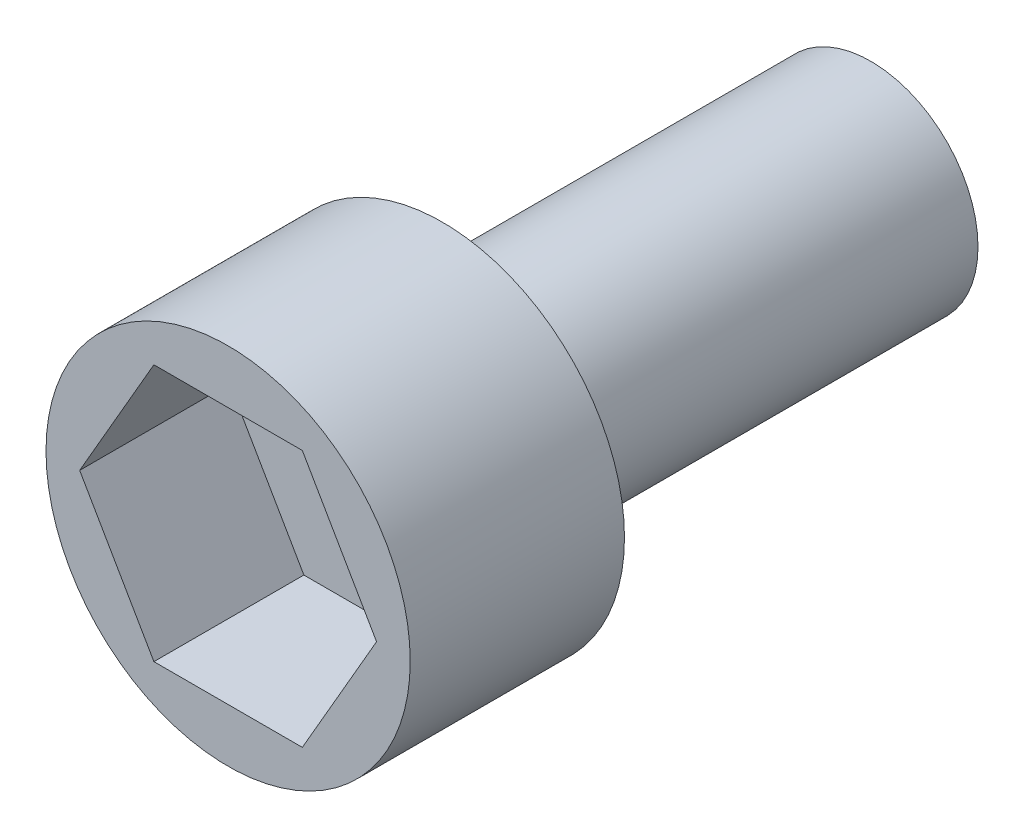
ISO-10303-21;
HEADER;
FILE_DESCRIPTION(('STEP AP214'),'2;1');
FILE_NAME('part.step','',(''),(''),'','','');
FILE_SCHEMA(('AUTOMOTIVE_DESIGN { 1 0 10303 214 1 1 1 1 }'));
ENDSEC;
DATA;
#1=APPLICATION_CONTEXT('core data for automotive mechanical design processes');
#2=APPLICATION_PROTOCOL_DEFINITION('international standard','automotive_design',2000,#1);
#3=PRODUCT_CONTEXT('',#1,'mechanical');
#4=PRODUCT('Part','Part','',(#3));
#5=PRODUCT_RELATED_PRODUCT_CATEGORY('part','',(#4));
#6=PRODUCT_DEFINITION_FORMATION('','',#4);
#7=PRODUCT_DEFINITION_CONTEXT('part definition',#1,'design');
#8=PRODUCT_DEFINITION('design','',#6,#7);
#9=PRODUCT_DEFINITION_SHAPE('','',#8);
#10=(LENGTH_UNIT() NAMED_UNIT(*) SI_UNIT(.MILLI.,.METRE.));
#11=(NAMED_UNIT(*) PLANE_ANGLE_UNIT() SI_UNIT($,.RADIAN.));
#12=(NAMED_UNIT(*) SI_UNIT($,.STERADIAN.) SOLID_ANGLE_UNIT());
#13=UNCERTAINTY_MEASURE_WITH_UNIT(LENGTH_MEASURE(1.E-05),#10,'distance_accuracy_value','');
#14=(GEOMETRIC_REPRESENTATION_CONTEXT(3) GLOBAL_UNCERTAINTY_ASSIGNED_CONTEXT((#13)) GLOBAL_UNIT_ASSIGNED_CONTEXT((#10,
#11,#12)) REPRESENTATION_CONTEXT('',''));
#15=CARTESIAN_POINT('',(0.,0.,0.));
#16=DIRECTION('',(0.,0.,1.));
#17=DIRECTION('',(1.,0.,0.));
#18=AXIS2_PLACEMENT_3D('',#15,#16,#17);
#19=CARTESIAN_POINT('',(0.,0.,10.));
#20=DIRECTION('',(0.,0.,-1.));
#21=DIRECTION('',(-1.,0.,0.));
#22=AXIS2_PLACEMENT_3D('',#19,#20,#21);
#23=CYLINDRICAL_SURFACE('',#22,2.5);
#24=CARTESIAN_POINT('',(0.,0.,10.));
#25=DIRECTION('',(0.,0.,1.));
#26=DIRECTION('',(1.,0.,0.));
#27=AXIS2_PLACEMENT_3D('',#24,#25,#26);
#28=CIRCLE('',#27,2.5);
#29=CARTESIAN_POINT('',(2.5,0.,10.));
#30=VERTEX_POINT('',#29);
#31=EDGE_CURVE('E11',#30,#30,#28,.T.);
#32=ORIENTED_EDGE('',*,*,#31,.F.);
#33=EDGE_LOOP('',(#32));
#34=FACE_BOUND('',#33,.T.);
#35=CARTESIAN_POINT('',(0.,0.,0.));
#36=DIRECTION('',(0.,0.,1.));
#37=DIRECTION('',(1.,0.,0.));
#38=AXIS2_PLACEMENT_3D('',#35,#36,#37);
#39=CIRCLE('',#38,2.5);
#40=CARTESIAN_POINT('',(2.5,0.,0.));
#41=VERTEX_POINT('',#40);
#42=EDGE_CURVE('E41',#41,#41,#39,.T.);
#43=ORIENTED_EDGE('',*,*,#42,.T.);
#44=EDGE_LOOP('',(#43));
#45=FACE_BOUND('',#44,.T.);
#46=ADVANCED_FACE('F38',(#34,#45),#23,.T.);
#47=CARTESIAN_POINT('',(0.,0.,0.));
#48=DIRECTION('',(0.,0.,1.));
#49=DIRECTION('',(1.,0.,0.));
#50=AXIS2_PLACEMENT_3D('',#47,#48,#49);
#51=PLANE('',#50);
#52=ORIENTED_EDGE('',*,*,#42,.F.);
#53=EDGE_LOOP('',(#52));
#54=FACE_BOUND('',#53,.T.);
#55=ADVANCED_FACE('F169',(#54),#51,.F.);
#56=CARTESIAN_POINT('',(0.,0.,15.));
#57=DIRECTION('',(0.,0.,-1.));
#58=DIRECTION('',(-1.,0.,0.));
#59=AXIS2_PLACEMENT_3D('',#56,#57,#58);
#60=CYLINDRICAL_SURFACE('',#59,4.25);
#61=CARTESIAN_POINT('',(0.,0.,15.));
#62=DIRECTION('',(0.,0.,1.));
#63=DIRECTION('',(1.,0.,0.));
#64=AXIS2_PLACEMENT_3D('',#61,#62,#63);
#65=CIRCLE('',#64,4.25);
#66=CARTESIAN_POINT('',(4.25,0.,15.));
#67=VERTEX_POINT('',#66);
#68=EDGE_CURVE('E145',#67,#67,#65,.T.);
#69=ORIENTED_EDGE('',*,*,#68,.F.);
#70=EDGE_LOOP('',(#69));
#71=FACE_BOUND('',#70,.T.);
#72=CARTESIAN_POINT('',(0.,0.,10.));
#73=DIRECTION('',(0.,0.,1.));
#74=DIRECTION('',(1.,0.,0.));
#75=AXIS2_PLACEMENT_3D('',#72,#73,#74);
#76=CIRCLE('',#75,4.25);
#77=CARTESIAN_POINT('',(4.25,0.,10.));
#78=VERTEX_POINT('',#77);
#79=EDGE_CURVE('E139',#78,#78,#76,.T.);
#80=ORIENTED_EDGE('',*,*,#79,.T.);
#81=EDGE_LOOP('',(#80));
#82=FACE_BOUND('',#81,.T.);
#83=ADVANCED_FACE('F151',(#71,#82),#60,.T.);
#84=CARTESIAN_POINT('',(0.,0.,15.));
#85=DIRECTION('',(0.,0.,1.));
#86=DIRECTION('',(1.,0.,0.));
#87=AXIS2_PLACEMENT_3D('',#84,#85,#86);
#88=PLANE('',#87);
#89=DIRECTION('',(0.5,0.866025403784439,0.));
#90=VECTOR('',#89,1.);
#91=CARTESIAN_POINT('',(1.73205080756888,-3.,15.));
#92=LINE('',#91,#90);
#93=CARTESIAN_POINT('',(1.73205080756888,-3.,15.));
#94=VERTEX_POINT('',#93);
#95=CARTESIAN_POINT('',(3.46410161513775,0.,15.));
#96=VERTEX_POINT('',#95);
#97=EDGE_CURVE('E52',#94,#96,#92,.T.);
#98=ORIENTED_EDGE('',*,*,#97,.F.);
#99=DIRECTION('',(1.,0.,0.));
#100=VECTOR('',#99,1.);
#101=CARTESIAN_POINT('',(-1.73205080756888,-3.,15.));
#102=LINE('',#101,#100);
#103=CARTESIAN_POINT('',(-1.73205080756888,-3.,15.));
#104=VERTEX_POINT('',#103);
#105=EDGE_CURVE('E135',#104,#94,#102,.T.);
#106=ORIENTED_EDGE('',*,*,#105,.F.);
#107=DIRECTION('',(0.5,-0.866025403784439,0.));
#108=VECTOR('',#107,1.);
#109=CARTESIAN_POINT('',(-3.46410161513775,0.,15.));
#110=LINE('',#109,#108);
#111=CARTESIAN_POINT('',(-3.46410161513775,0.,15.));
#112=VERTEX_POINT('',#111);
#113=EDGE_CURVE('E133',#112,#104,#110,.T.);
#114=ORIENTED_EDGE('',*,*,#113,.F.);
#115=DIRECTION('',(-0.5,-0.866025403784439,0.));
#116=VECTOR('',#115,1.);
#117=CARTESIAN_POINT('',(-1.73205080756888,3.,15.));
#118=LINE('',#117,#116);
#119=CARTESIAN_POINT('',(-1.73205080756888,3.,15.));
#120=VERTEX_POINT('',#119);
#121=EDGE_CURVE('E100',#120,#112,#118,.T.);
#122=ORIENTED_EDGE('',*,*,#121,.F.);
#123=DIRECTION('',(-1.,0.,0.));
#124=VECTOR('',#123,1.);
#125=CARTESIAN_POINT('',(1.73205080756888,3.,15.));
#126=LINE('',#125,#124);
#127=CARTESIAN_POINT('',(1.73205080756888,3.,15.));
#128=VERTEX_POINT('',#127);
#129=EDGE_CURVE('E129',#128,#120,#126,.T.);
#130=ORIENTED_EDGE('',*,*,#129,.F.);
#131=DIRECTION('',(-0.5,0.866025403784438,0.));
#132=VECTOR('',#131,1.);
#133=CARTESIAN_POINT('',(3.46410161513775,0.,15.));
#134=LINE('',#133,#132);
#135=EDGE_CURVE('E126',#96,#128,#134,.T.);
#136=ORIENTED_EDGE('',*,*,#135,.F.);
#137=EDGE_LOOP('',(#98,#106,#114,#122,#130,#136));
#138=FACE_BOUND('',#137,.T.);
#139=ORIENTED_EDGE('',*,*,#68,.T.);
#140=EDGE_LOOP('',(#139));
#141=FACE_BOUND('',#140,.T.);
#142=ADVANCED_FACE('F156',(#138,#141),#88,.T.);
#143=CARTESIAN_POINT('',(0.,0.,10.));
#144=DIRECTION('',(0.,0.,1.));
#145=DIRECTION('',(1.,0.,0.));
#146=AXIS2_PLACEMENT_3D('',#143,#144,#145);
#147=PLANE('',#146);
#148=ORIENTED_EDGE('',*,*,#31,.T.);
#149=EDGE_LOOP('',(#148));
#150=FACE_BOUND('',#149,.T.);
#151=ORIENTED_EDGE('',*,*,#79,.F.);
#152=EDGE_LOOP('',(#151));
#153=FACE_BOUND('',#152,.T.);
#154=ADVANCED_FACE('F153',(#150,#153),#147,.F.);
#155=CARTESIAN_POINT('',(1.73205080756888,-3.,11.5));
#156=DIRECTION('',(0.866025403784439,-0.5,0.));
#157=DIRECTION('',(0.5,0.866025403784439,0.));
#158=AXIS2_PLACEMENT_3D('',#155,#156,#157);
#159=PLANE('',#158);
#160=ORIENTED_EDGE('',*,*,#97,.T.);
#161=DIRECTION('',(0.,0.,1.));
#162=VECTOR('',#161,1.);
#163=CARTESIAN_POINT('',(3.46410161513775,0.,11.5));
#164=LINE('',#163,#162);
#165=CARTESIAN_POINT('',(3.46410161513775,0.,11.5));
#166=VERTEX_POINT('',#165);
#167=EDGE_CURVE('E82',#166,#96,#164,.T.);
#168=ORIENTED_EDGE('',*,*,#167,.F.);
#169=DIRECTION('',(0.5,0.866025403784439,0.));
#170=VECTOR('',#169,1.);
#171=CARTESIAN_POINT('',(1.73205080756888,-3.,11.5));
#172=LINE('',#171,#170);
#173=CARTESIAN_POINT('',(1.73205080756888,-3.,11.5));
#174=VERTEX_POINT('',#173);
#175=EDGE_CURVE('E137',#174,#166,#172,.T.);
#176=ORIENTED_EDGE('',*,*,#175,.F.);
#177=DIRECTION('',(0.,0.,1.));
#178=VECTOR('',#177,1.);
#179=CARTESIAN_POINT('',(1.73205080756888,-3.,11.5));
#180=LINE('',#179,#178);
#181=EDGE_CURVE('E60',#174,#94,#180,.T.);
#182=ORIENTED_EDGE('',*,*,#181,.T.);
#183=EDGE_LOOP('',(#160,#168,#176,#182));
#184=FACE_BOUND('',#183,.T.);
#185=ADVANCED_FACE('F155',(#184),#159,.F.);
#186=CARTESIAN_POINT('',(-1.73205080756888,-3.,11.5));
#187=DIRECTION('',(0.,-1.,0.));
#188=DIRECTION('',(0.,0.,-1.));
#189=AXIS2_PLACEMENT_3D('',#186,#187,#188);
#190=PLANE('',#189);
#191=ORIENTED_EDGE('',*,*,#105,.T.);
#192=ORIENTED_EDGE('',*,*,#181,.F.);
#193=DIRECTION('',(1.,0.,0.));
#194=VECTOR('',#193,1.);
#195=CARTESIAN_POINT('',(-1.73205080756888,-3.,11.5));
#196=LINE('',#195,#194);
#197=CARTESIAN_POINT('',(-1.73205080756888,-3.,11.5));
#198=VERTEX_POINT('',#197);
#199=EDGE_CURVE('E112',#198,#174,#196,.T.);
#200=ORIENTED_EDGE('',*,*,#199,.F.);
#201=DIRECTION('',(0.,0.,1.));
#202=VECTOR('',#201,1.);
#203=CARTESIAN_POINT('',(-1.73205080756888,-3.,11.5));
#204=LINE('',#203,#202);
#205=EDGE_CURVE('E104',#198,#104,#204,.T.);
#206=ORIENTED_EDGE('',*,*,#205,.T.);
#207=EDGE_LOOP('',(#191,#192,#200,#206));
#208=FACE_BOUND('',#207,.T.);
#209=ADVANCED_FACE('F163',(#208),#190,.F.);
#210=CARTESIAN_POINT('',(-3.46410161513775,0.,11.5));
#211=DIRECTION('',(-0.866025403784439,-0.5,0.));
#212=DIRECTION('',(0.5,-0.866025403784439,0.));
#213=AXIS2_PLACEMENT_3D('',#210,#211,#212);
#214=PLANE('',#213);
#215=ORIENTED_EDGE('',*,*,#113,.T.);
#216=ORIENTED_EDGE('',*,*,#205,.F.);
#217=DIRECTION('',(0.5,-0.866025403784439,0.));
#218=VECTOR('',#217,1.);
#219=CARTESIAN_POINT('',(-3.46410161513775,0.,11.5));
#220=LINE('',#219,#218);
#221=CARTESIAN_POINT('',(-3.46410161513775,0.,11.5));
#222=VERTEX_POINT('',#221);
#223=EDGE_CURVE('E108',#222,#198,#220,.T.);
#224=ORIENTED_EDGE('',*,*,#223,.F.);
#225=DIRECTION('',(0.,0.,1.));
#226=VECTOR('',#225,1.);
#227=CARTESIAN_POINT('',(-3.46410161513775,0.,11.5));
#228=LINE('',#227,#226);
#229=EDGE_CURVE('E93',#222,#112,#228,.T.);
#230=ORIENTED_EDGE('',*,*,#229,.T.);
#231=EDGE_LOOP('',(#215,#216,#224,#230));
#232=FACE_BOUND('',#231,.T.);
#233=ADVANCED_FACE('F109',(#232),#214,.F.);
#234=CARTESIAN_POINT('',(-1.73205080756888,3.,11.5));
#235=DIRECTION('',(-0.866025403784439,0.5,0.));
#236=DIRECTION('',(-0.5,-0.866025403784439,0.));
#237=AXIS2_PLACEMENT_3D('',#234,#235,#236);
#238=PLANE('',#237);
#239=ORIENTED_EDGE('',*,*,#121,.T.);
#240=ORIENTED_EDGE('',*,*,#229,.F.);
#241=DIRECTION('',(-0.5,-0.866025403784439,0.));
#242=VECTOR('',#241,1.);
#243=CARTESIAN_POINT('',(-1.73205080756888,3.,11.5));
#244=LINE('',#243,#242);
#245=CARTESIAN_POINT('',(-1.73205080756888,3.,11.5));
#246=VERTEX_POINT('',#245);
#247=EDGE_CURVE('E97',#246,#222,#244,.T.);
#248=ORIENTED_EDGE('',*,*,#247,.F.);
#249=DIRECTION('',(0.,0.,1.));
#250=VECTOR('',#249,1.);
#251=CARTESIAN_POINT('',(-1.73205080756888,3.,11.5));
#252=LINE('',#251,#250);
#253=EDGE_CURVE('E105',#246,#120,#252,.T.);
#254=ORIENTED_EDGE('',*,*,#253,.T.);
#255=EDGE_LOOP('',(#239,#240,#248,#254));
#256=FACE_BOUND('',#255,.T.);
#257=ADVANCED_FACE('F95',(#256),#238,.F.);
#258=CARTESIAN_POINT('',(1.73205080756888,3.,11.5));
#259=DIRECTION('',(0.,1.,0.));
#260=DIRECTION('',(0.,0.,1.));
#261=AXIS2_PLACEMENT_3D('',#258,#259,#260);
#262=PLANE('',#261);
#263=ORIENTED_EDGE('',*,*,#129,.T.);
#264=ORIENTED_EDGE('',*,*,#253,.F.);
#265=DIRECTION('',(-1.,0.,0.));
#266=VECTOR('',#265,1.);
#267=CARTESIAN_POINT('',(1.73205080756888,3.,11.5));
#268=LINE('',#267,#266);
#269=CARTESIAN_POINT('',(1.73205080756888,3.,11.5));
#270=VERTEX_POINT('',#269);
#271=EDGE_CURVE('E118',#270,#246,#268,.T.);
#272=ORIENTED_EDGE('',*,*,#271,.F.);
#273=DIRECTION('',(0.,0.,1.));
#274=VECTOR('',#273,1.);
#275=CARTESIAN_POINT('',(1.73205080756888,3.,11.5));
#276=LINE('',#275,#274);
#277=EDGE_CURVE('E142',#270,#128,#276,.T.);
#278=ORIENTED_EDGE('',*,*,#277,.T.);
#279=EDGE_LOOP('',(#263,#264,#272,#278));
#280=FACE_BOUND('',#279,.T.);
#281=ADVANCED_FACE('F224',(#280),#262,.F.);
#282=CARTESIAN_POINT('',(3.46410161513775,0.,11.5));
#283=DIRECTION('',(0.866025403784438,0.5,0.));
#284=DIRECTION('',(-0.5,0.866025403784439,0.));
#285=AXIS2_PLACEMENT_3D('',#282,#283,#284);
#286=PLANE('',#285);
#287=ORIENTED_EDGE('',*,*,#135,.T.);
#288=ORIENTED_EDGE('',*,*,#277,.F.);
#289=DIRECTION('',(-0.5,0.866025403784438,0.));
#290=VECTOR('',#289,1.);
#291=CARTESIAN_POINT('',(3.46410161513775,0.,11.5));
#292=LINE('',#291,#290);
#293=EDGE_CURVE('E120',#166,#270,#292,.T.);
#294=ORIENTED_EDGE('',*,*,#293,.F.);
#295=ORIENTED_EDGE('',*,*,#167,.T.);
#296=EDGE_LOOP('',(#287,#288,#294,#295));
#297=FACE_BOUND('',#296,.T.);
#298=ADVANCED_FACE('F233',(#297),#286,.F.);
#299=CARTESIAN_POINT('',(0.,0.,11.5));
#300=DIRECTION('',(0.,0.,1.));
#301=DIRECTION('',(1.,0.,0.));
#302=AXIS2_PLACEMENT_3D('',#299,#300,#301);
#303=PLANE('',#302);
#304=ORIENTED_EDGE('',*,*,#175,.T.);
#305=ORIENTED_EDGE('',*,*,#293,.T.);
#306=ORIENTED_EDGE('',*,*,#271,.T.);
#307=ORIENTED_EDGE('',*,*,#247,.T.);
#308=ORIENTED_EDGE('',*,*,#223,.T.);
#309=ORIENTED_EDGE('',*,*,#199,.T.);
#310=EDGE_LOOP('',(#304,#305,#306,#307,#308,#309));
#311=FACE_BOUND('',#310,.T.);
#312=ADVANCED_FACE('F115',(#311),#303,.T.);
#313=CLOSED_SHELL('',(#46,#55,#83,#142,#154,#185,#209,#233,#257,#281,#298,#312));
#314=MANIFOLD_SOLID_BREP('B2',#313);
#315=ADVANCED_BREP_SHAPE_REPRESENTATION('',(#18,#314),#14);
#316=SHAPE_DEFINITION_REPRESENTATION(#9,#315);
ENDSEC;
END-ISO-10303-21;
